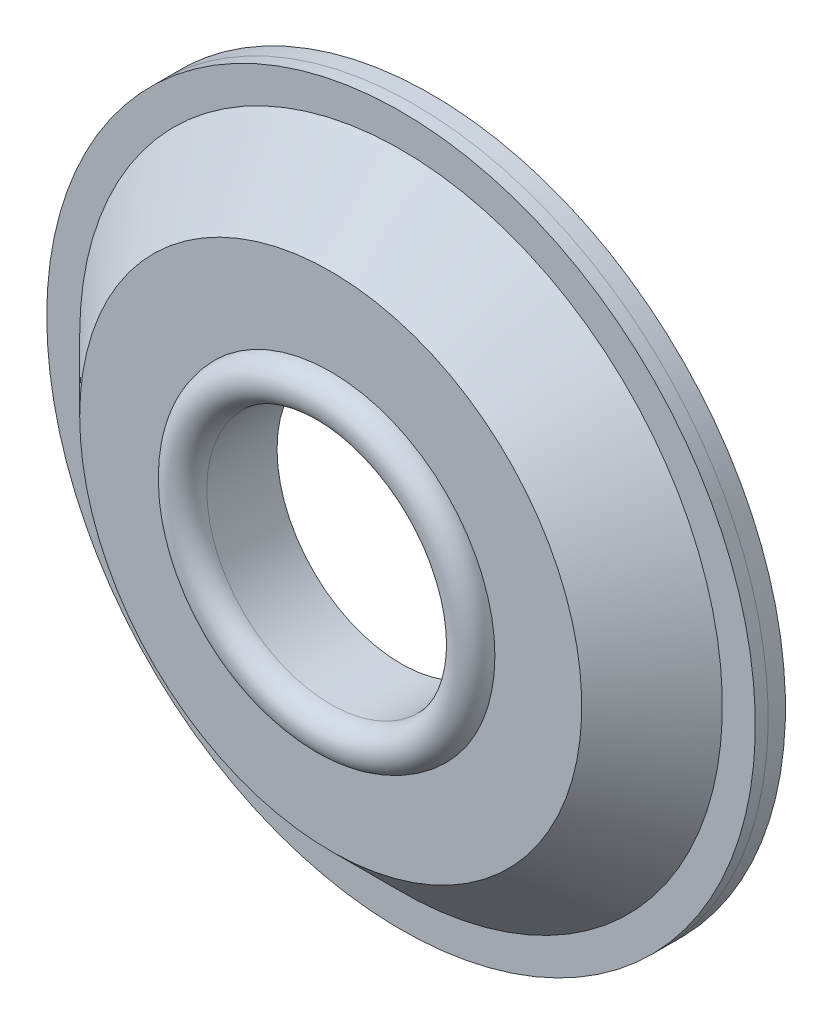
ISO-10303-21;
HEADER;
FILE_DESCRIPTION(('STEP AP214'),'2;1');
FILE_NAME('part.step','',(''),(''),'','','');
FILE_SCHEMA(('AUTOMOTIVE_DESIGN { 1 0 10303 214 1 1 1 1 }'));
ENDSEC;
DATA;
#1=APPLICATION_CONTEXT('core data for automotive mechanical design processes');
#2=APPLICATION_PROTOCOL_DEFINITION('international standard','automotive_design',2000,#1);
#3=PRODUCT_CONTEXT('',#1,'mechanical');
#4=PRODUCT('Part','Part','',(#3));
#5=PRODUCT_RELATED_PRODUCT_CATEGORY('part','',(#4));
#6=PRODUCT_DEFINITION_FORMATION('','',#4);
#7=PRODUCT_DEFINITION_CONTEXT('part definition',#1,'design');
#8=PRODUCT_DEFINITION('design','',#6,#7);
#9=PRODUCT_DEFINITION_SHAPE('','',#8);
#10=(LENGTH_UNIT() NAMED_UNIT(*) SI_UNIT(.MILLI.,.METRE.));
#11=(NAMED_UNIT(*) PLANE_ANGLE_UNIT() SI_UNIT($,.RADIAN.));
#12=(NAMED_UNIT(*) SI_UNIT($,.STERADIAN.) SOLID_ANGLE_UNIT());
#13=UNCERTAINTY_MEASURE_WITH_UNIT(LENGTH_MEASURE(1.E-05),#10,'distance_accuracy_value','');
#14=(GEOMETRIC_REPRESENTATION_CONTEXT(3) GLOBAL_UNCERTAINTY_ASSIGNED_CONTEXT((#13)) GLOBAL_UNIT_ASSIGNED_CONTEXT((#10,
#11,#12)) REPRESENTATION_CONTEXT('',''));
#15=CARTESIAN_POINT('',(0.,0.,0.));
#16=DIRECTION('',(0.,0.,1.));
#17=DIRECTION('',(1.,0.,0.));
#18=AXIS2_PLACEMENT_3D('',#15,#16,#17);
#19=CARTESIAN_POINT('',(0.,0.,1.3890625));
#20=DIRECTION('',(0.,0.,-1.));
#21=DIRECTION('',(-1.,0.,0.));
#22=AXIS2_PLACEMENT_3D('',#19,#20,#21);
#23=TOROIDAL_SURFACE('',#22,2.846875,0.396875);
#24=CARTESIAN_POINT('',(0.,0.,1.3890625));
#25=DIRECTION('',(0.,0.,-1.));
#26=DIRECTION('',(-1.,0.,0.));
#27=AXIS2_PLACEMENT_3D('',#24,#25,#26);
#28=CIRCLE('',#27,3.24375);
#29=CARTESIAN_POINT('',(-3.24375,0.,1.3890625));
#30=VERTEX_POINT('',#29);
#31=EDGE_CURVE('E11',#30,#30,#28,.T.);
#32=ORIENTED_EDGE('',*,*,#31,.F.);
#33=EDGE_LOOP('',(#32));
#34=FACE_BOUND('',#33,.T.);
#35=CARTESIAN_POINT('',(0.,0.,1.3890625));
#36=DIRECTION('',(0.,0.,-1.));
#37=DIRECTION('',(-1.,0.,0.));
#38=AXIS2_PLACEMENT_3D('',#35,#36,#37);
#39=CIRCLE('',#38,2.45);
#40=CARTESIAN_POINT('',(-2.45,0.,1.3890625));
#41=VERTEX_POINT('',#40);
#42=EDGE_CURVE('E91',#41,#41,#39,.T.);
#43=ORIENTED_EDGE('',*,*,#42,.T.);
#44=EDGE_LOOP('',(#43));
#45=FACE_BOUND('',#44,.T.);
#46=ADVANCED_FACE('F42',(#34,#45),#23,.T.);
#47=CARTESIAN_POINT('',(3.24375,0.,1.3890625));
#48=DIRECTION('',(0.,0.,1.));
#49=DIRECTION('',(1.,0.,0.));
#50=AXIS2_PLACEMENT_3D('',#47,#48,#49);
#51=PLANE('',#50);
#52=CARTESIAN_POINT('',(0.,0.,1.3890625));
#53=DIRECTION('',(0.,0.,-1.));
#54=DIRECTION('',(-1.,0.,0.));
#55=AXIS2_PLACEMENT_3D('',#52,#53,#54);
#56=CIRCLE('',#55,2.70399999999999);
#57=CARTESIAN_POINT('',(-2.70399999999999,0.,1.3890625));
#58=VERTEX_POINT('',#57);
#59=EDGE_CURVE('E48',#58,#58,#56,.T.);
#60=ORIENTED_EDGE('',*,*,#59,.F.);
#61=EDGE_LOOP('',(#60));
#62=FACE_BOUND('',#61,.T.);
#63=ORIENTED_EDGE('',*,*,#31,.T.);
#64=EDGE_LOOP('',(#63));
#65=FACE_BOUND('',#64,.T.);
#66=ADVANCED_FACE('F170',(#62,#65),#51,.F.);
#67=CARTESIAN_POINT('',(0.,0.,-2.0850225));
#68=DIRECTION('',(0.,0.,-1.));
#69=DIRECTION('',(-1.,0.,0.));
#70=AXIS2_PLACEMENT_3D('',#67,#68,#69);
#71=CYLINDRICAL_SURFACE('',#70,2.70399999999999);
#72=CARTESIAN_POINT('',(0.,0.,1.1350625));
#73=DIRECTION('',(0.,0.,-1.));
#74=DIRECTION('',(-1.,0.,0.));
#75=AXIS2_PLACEMENT_3D('',#72,#73,#74);
#76=CIRCLE('',#75,2.70399999999999);
#77=CARTESIAN_POINT('',(-2.70399999999999,0.,1.1350625));
#78=VERTEX_POINT('',#77);
#79=EDGE_CURVE('E52',#78,#78,#76,.T.);
#80=ORIENTED_EDGE('',*,*,#79,.F.);
#81=EDGE_LOOP('',(#80));
#82=FACE_BOUND('',#81,.T.);
#83=ORIENTED_EDGE('',*,*,#59,.T.);
#84=EDGE_LOOP('',(#83));
#85=FACE_BOUND('',#84,.T.);
#86=ADVANCED_FACE('F165',(#82,#85),#71,.T.);
#87=CARTESIAN_POINT('',(2.70399999999999,0.,1.1350625));
#88=DIRECTION('',(0.,0.,-1.));
#89=DIRECTION('',(-1.,0.,0.));
#90=AXIS2_PLACEMENT_3D('',#87,#88,#89);
#91=PLANE('',#90);
#92=CARTESIAN_POINT('',(0.,0.,1.1350625));
#93=DIRECTION('',(0.,0.,-1.));
#94=DIRECTION('',(-1.,0.,0.));
#95=AXIS2_PLACEMENT_3D('',#92,#93,#94);
#96=CIRCLE('',#95,4.85485225515724);
#97=CARTESIAN_POINT('',(-4.85485225515724,0.,1.1350625));
#98=VERTEX_POINT('',#97);
#99=EDGE_CURVE('E56',#98,#98,#96,.T.);
#100=ORIENTED_EDGE('',*,*,#99,.F.);
#101=EDGE_LOOP('',(#100));
#102=FACE_BOUND('',#101,.T.);
#103=ORIENTED_EDGE('',*,*,#79,.T.);
#104=EDGE_LOOP('',(#103));
#105=FACE_BOUND('',#104,.T.);
#106=ADVANCED_FACE('F159',(#102,#105),#91,.F.);
#107=CARTESIAN_POINT('',(0.,0.,1.1350625));
#108=DIRECTION('',(0.,0.,-1.));
#109=DIRECTION('',(-1.,0.,0.));
#110=AXIS2_PLACEMENT_3D('',#107,#108,#109);
#111=CONICAL_SURFACE('',#110,4.85485225515724,0.785398163397446);
#112=CARTESIAN_POINT('',(0.,0.,-0.253999999999999));
#113=DIRECTION('',(0.,0.,-1.));
#114=DIRECTION('',(-1.,0.,0.));
#115=AXIS2_PLACEMENT_3D('',#112,#113,#114);
#116=CIRCLE('',#115,6.24391475515723);
#117=CARTESIAN_POINT('',(-6.24391475515723,0.,-0.253999999999999));
#118=VERTEX_POINT('',#117);
#119=EDGE_CURVE('E61',#118,#118,#116,.T.);
#120=ORIENTED_EDGE('',*,*,#119,.F.);
#121=EDGE_LOOP('',(#120));
#122=FACE_BOUND('',#121,.T.);
#123=ORIENTED_EDGE('',*,*,#99,.T.);
#124=EDGE_LOOP('',(#123));
#125=FACE_BOUND('',#124,.T.);
#126=ADVANCED_FACE('F153',(#122,#125),#111,.T.);
#127=CARTESIAN_POINT('',(6.24391475515723,0.,-0.253999999999999));
#128=DIRECTION('',(0.,0.,-1.));
#129=DIRECTION('',(-1.,0.,0.));
#130=AXIS2_PLACEMENT_3D('',#127,#128,#129);
#131=PLANE('',#130);
#132=CARTESIAN_POINT('',(0.,0.,-0.253999999999999));
#133=DIRECTION('',(0.,0.,-1.));
#134=DIRECTION('',(-1.,0.,0.));
#135=AXIS2_PLACEMENT_3D('',#132,#133,#134);
#136=CIRCLE('',#135,7.);
#137=CARTESIAN_POINT('',(-7.,0.,-0.253999999999999));
#138=VERTEX_POINT('',#137);
#139=EDGE_CURVE('E64',#138,#138,#136,.T.);
#140=ORIENTED_EDGE('',*,*,#139,.F.);
#141=EDGE_LOOP('',(#140));
#142=FACE_BOUND('',#141,.T.);
#143=ORIENTED_EDGE('',*,*,#119,.T.);
#144=EDGE_LOOP('',(#143));
#145=FACE_BOUND('',#144,.T.);
#146=ADVANCED_FACE('F147',(#142,#145),#131,.F.);
#147=CARTESIAN_POINT('',(0.,0.,-2.0850225));
#148=DIRECTION('',(0.,0.,-1.));
#149=DIRECTION('',(-1.,0.,0.));
#150=AXIS2_PLACEMENT_3D('',#147,#148,#149);
#151=CYLINDRICAL_SURFACE('',#150,7.);
#152=CARTESIAN_POINT('',(0.,0.,-0.5953125));
#153=DIRECTION('',(0.,0.,-1.));
#154=DIRECTION('',(-1.,0.,0.));
#155=AXIS2_PLACEMENT_3D('',#152,#153,#154);
#156=CIRCLE('',#155,7.);
#157=CARTESIAN_POINT('',(-7.,0.,-0.5953125));
#158=VERTEX_POINT('',#157);
#159=EDGE_CURVE('E67',#158,#158,#156,.T.);
#160=ORIENTED_EDGE('',*,*,#159,.F.);
#161=EDGE_LOOP('',(#160));
#162=FACE_BOUND('',#161,.T.);
#163=ORIENTED_EDGE('',*,*,#139,.T.);
#164=EDGE_LOOP('',(#163));
#165=FACE_BOUND('',#164,.T.);
#166=ADVANCED_FACE('F141',(#162,#165),#151,.T.);
#167=CARTESIAN_POINT('',(5.809375,0.,-0.595312500000001));
#168=DIRECTION('',(0.,0.,1.));
#169=DIRECTION('',(1.,0.,0.));
#170=AXIS2_PLACEMENT_3D('',#167,#168,#169);
#171=PLANE('',#170);
#172=CARTESIAN_POINT('',(0.,0.,-0.595312500000001));
#173=DIRECTION('',(0.,0.,-1.));
#174=DIRECTION('',(-1.,0.,0.));
#175=AXIS2_PLACEMENT_3D('',#172,#173,#174);
#176=CIRCLE('',#175,5.809375);
#177=CARTESIAN_POINT('',(-5.809375,0.,-0.595312500000001));
#178=VERTEX_POINT('',#177);
#179=EDGE_CURVE('E70',#178,#178,#176,.T.);
#180=ORIENTED_EDGE('',*,*,#179,.F.);
#181=EDGE_LOOP('',(#180));
#182=FACE_BOUND('',#181,.T.);
#183=ORIENTED_EDGE('',*,*,#159,.T.);
#184=EDGE_LOOP('',(#183));
#185=FACE_BOUND('',#184,.T.);
#186=ADVANCED_FACE('F135',(#182,#185),#171,.F.);
#187=CARTESIAN_POINT('',(0.,0.,-0.595312500000001));
#188=DIRECTION('',(0.,0.,-1.));
#189=DIRECTION('',(-1.,0.,0.));
#190=AXIS2_PLACEMENT_3D('',#187,#188,#189);
#191=CONICAL_SURFACE('',#190,5.809375,0.785398163397445);
#192=CARTESIAN_POINT('',(0.,0.,0.254));
#193=DIRECTION('',(0.,0.,-1.));
#194=DIRECTION('',(-1.,0.,0.));
#195=AXIS2_PLACEMENT_3D('',#192,#193,#194);
#196=CIRCLE('',#195,4.9600625);
#197=CARTESIAN_POINT('',(-4.9600625,0.,0.254));
#198=VERTEX_POINT('',#197);
#199=EDGE_CURVE('E73',#198,#198,#196,.T.);
#200=ORIENTED_EDGE('',*,*,#199,.F.);
#201=EDGE_LOOP('',(#200));
#202=FACE_BOUND('',#201,.T.);
#203=ORIENTED_EDGE('',*,*,#179,.T.);
#204=EDGE_LOOP('',(#203));
#205=FACE_BOUND('',#204,.T.);
#206=ADVANCED_FACE('F129',(#202,#205),#191,.F.);
#207=CARTESIAN_POINT('',(0.,0.,0.254));
#208=DIRECTION('',(0.,0.,1.));
#209=DIRECTION('',(1.,0.,0.));
#210=AXIS2_PLACEMENT_3D('',#207,#208,#209);
#211=CONICAL_SURFACE('',#210,4.9600625,0.436332312998582);
#212=CARTESIAN_POINT('',(0.,0.,-0.982662500000005));
#213=DIRECTION('',(0.,0.,-1.));
#214=DIRECTION('',(-1.,0.,0.));
#215=AXIS2_PLACEMENT_3D('',#212,#213,#214);
#216=CIRCLE('',#215,4.3833973056969);
#217=CARTESIAN_POINT('',(-4.3833973056969,0.,-0.982662500000005));
#218=VERTEX_POINT('',#217);
#219=EDGE_CURVE('E76',#218,#218,#216,.T.);
#220=ORIENTED_EDGE('',*,*,#219,.F.);
#221=EDGE_LOOP('',(#220));
#222=FACE_BOUND('',#221,.T.);
#223=ORIENTED_EDGE('',*,*,#199,.T.);
#224=EDGE_LOOP('',(#223));
#225=FACE_BOUND('',#224,.T.);
#226=ADVANCED_FACE('F123',(#222,#225),#211,.T.);
#227=CARTESIAN_POINT('',(0.,0.,-0.982662500000005));
#228=DIRECTION('',(0.,0.,-1.));
#229=DIRECTION('',(-1.,0.,0.));
#230=AXIS2_PLACEMENT_3D('',#227,#228,#229);
#231=CONICAL_SURFACE('',#230,4.3833973056969,0.436332312998576);
#232=CARTESIAN_POINT('',(0.,0.,0.635));
#233=DIRECTION('',(0.,0.,-1.));
#234=DIRECTION('',(-1.,0.,0.));
#235=AXIS2_PLACEMENT_3D('',#232,#233,#234);
#236=CIRCLE('',#235,3.62906889363675);
#237=CARTESIAN_POINT('',(-3.62906889363675,0.,0.635));
#238=VERTEX_POINT('',#237);
#239=EDGE_CURVE('E79',#238,#238,#236,.T.);
#240=ORIENTED_EDGE('',*,*,#239,.F.);
#241=EDGE_LOOP('',(#240));
#242=FACE_BOUND('',#241,.T.);
#243=ORIENTED_EDGE('',*,*,#219,.T.);
#244=EDGE_LOOP('',(#243));
#245=FACE_BOUND('',#244,.T.);
#246=ADVANCED_FACE('F117',(#242,#245),#231,.F.);
#247=CARTESIAN_POINT('',(3.56125,0.,0.635));
#248=DIRECTION('',(0.,0.,1.));
#249=DIRECTION('',(1.,0.,0.));
#250=AXIS2_PLACEMENT_3D('',#247,#248,#249);
#251=PLANE('',#250);
#252=CARTESIAN_POINT('',(0.,0.,0.635));
#253=DIRECTION('',(0.,0.,-1.));
#254=DIRECTION('',(-1.,0.,0.));
#255=AXIS2_PLACEMENT_3D('',#252,#253,#254);
#256=CIRCLE('',#255,3.56125);
#257=CARTESIAN_POINT('',(-3.56125,0.,0.635));
#258=VERTEX_POINT('',#257);
#259=EDGE_CURVE('E82',#258,#258,#256,.T.);
#260=ORIENTED_EDGE('',*,*,#259,.F.);
#261=EDGE_LOOP('',(#260));
#262=FACE_BOUND('',#261,.T.);
#263=ORIENTED_EDGE('',*,*,#239,.T.);
#264=EDGE_LOOP('',(#263));
#265=FACE_BOUND('',#264,.T.);
#266=ADVANCED_FACE('F111',(#262,#265),#251,.F.);
#267=CARTESIAN_POINT('',(0.,0.,-2.0850225));
#268=DIRECTION('',(0.,0.,-1.));
#269=DIRECTION('',(-1.,0.,0.));
#270=AXIS2_PLACEMENT_3D('',#267,#268,#269);
#271=CYLINDRICAL_SURFACE('',#270,3.56125);
#272=CARTESIAN_POINT('',(0.,0.,0.));
#273=DIRECTION('',(0.,0.,-1.));
#274=DIRECTION('',(-1.,0.,0.));
#275=AXIS2_PLACEMENT_3D('',#272,#273,#274);
#276=CIRCLE('',#275,3.56125);
#277=CARTESIAN_POINT('',(-3.56125,0.,0.));
#278=VERTEX_POINT('',#277);
#279=EDGE_CURVE('E85',#278,#278,#276,.T.);
#280=ORIENTED_EDGE('',*,*,#279,.F.);
#281=EDGE_LOOP('',(#280));
#282=FACE_BOUND('',#281,.T.);
#283=ORIENTED_EDGE('',*,*,#259,.T.);
#284=EDGE_LOOP('',(#283));
#285=FACE_BOUND('',#284,.T.);
#286=ADVANCED_FACE('F105',(#282,#285),#271,.T.);
#287=CARTESIAN_POINT('',(2.45,0.,0.));
#288=DIRECTION('',(0.,0.,1.));
#289=DIRECTION('',(1.,0.,0.));
#290=AXIS2_PLACEMENT_3D('',#287,#288,#289);
#291=PLANE('',#290);
#292=CARTESIAN_POINT('',(0.,0.,0.));
#293=DIRECTION('',(0.,0.,-1.));
#294=DIRECTION('',(-1.,0.,0.));
#295=AXIS2_PLACEMENT_3D('',#292,#293,#294);
#296=CIRCLE('',#295,2.45);
#297=CARTESIAN_POINT('',(-2.45,0.,0.));
#298=VERTEX_POINT('',#297);
#299=EDGE_CURVE('E88',#298,#298,#296,.T.);
#300=ORIENTED_EDGE('',*,*,#299,.F.);
#301=EDGE_LOOP('',(#300));
#302=FACE_BOUND('',#301,.T.);
#303=ORIENTED_EDGE('',*,*,#279,.T.);
#304=EDGE_LOOP('',(#303));
#305=FACE_BOUND('',#304,.T.);
#306=ADVANCED_FACE('F99',(#302,#305),#291,.F.);
#307=CARTESIAN_POINT('',(0.,0.,-2.0850225));
#308=DIRECTION('',(0.,0.,-1.));
#309=DIRECTION('',(-1.,0.,0.));
#310=AXIS2_PLACEMENT_3D('',#307,#308,#309);
#311=CYLINDRICAL_SURFACE('',#310,2.45);
#312=ORIENTED_EDGE('',*,*,#42,.F.);
#313=EDGE_LOOP('',(#312));
#314=FACE_BOUND('',#313,.T.);
#315=ORIENTED_EDGE('',*,*,#299,.T.);
#316=EDGE_LOOP('',(#315));
#317=FACE_BOUND('',#316,.T.);
#318=ADVANCED_FACE('F96',(#314,#317),#311,.F.);
#319=CLOSED_SHELL('',(#46,#66,#86,#106,#126,#146,#166,#186,#206,#226,#246,#266,#286,#306,#318));
#320=MANIFOLD_SOLID_BREP('B2',#319);
#321=CARTESIAN_POINT('',(3.24375,0.,1.3890625));
#322=DIRECTION('',(0.,0.,-1.));
#323=DIRECTION('',(-1.,0.,0.));
#324=AXIS2_PLACEMENT_3D('',#321,#322,#323);
#325=PLANE('',#324);
#326=CARTESIAN_POINT('',(0.,0.,1.3890625));
#327=DIRECTION('',(0.,0.,-1.));
#328=DIRECTION('',(-1.,0.,0.));
#329=AXIS2_PLACEMENT_3D('',#326,#327,#328);
#330=CIRCLE('',#329,4.9600625);
#331=CARTESIAN_POINT('',(-4.9600625,0.,1.3890625));
#332=VERTEX_POINT('',#331);
#333=EDGE_CURVE('E296',#332,#332,#330,.T.);
#334=ORIENTED_EDGE('',*,*,#333,.F.);
#335=EDGE_LOOP('',(#334));
#336=FACE_BOUND('',#335,.T.);
#337=CARTESIAN_POINT('',(0.,0.,1.3890625));
#338=DIRECTION('',(0.,0.,-1.));
#339=DIRECTION('',(-1.,0.,0.));
#340=AXIS2_PLACEMENT_3D('',#337,#338,#339);
#341=CIRCLE('',#340,2.70399999999999);
#342=CARTESIAN_POINT('',(-2.70399999999999,0.,1.3890625));
#343=VERTEX_POINT('',#342);
#344=EDGE_CURVE('E41',#343,#343,#341,.T.);
#345=ORIENTED_EDGE('',*,*,#344,.T.);
#346=EDGE_LOOP('',(#345));
#347=FACE_BOUND('',#346,.T.);
#348=ADVANCED_FACE('F268',(#336,#347),#325,.F.);
#349=CARTESIAN_POINT('',(0.,0.,-2.0850225));
#350=DIRECTION('',(0.,0.,-1.));
#351=DIRECTION('',(-1.,0.,0.));
#352=AXIS2_PLACEMENT_3D('',#349,#350,#351);
#353=CYLINDRICAL_SURFACE('',#352,2.70399999999999);
#354=ORIENTED_EDGE('',*,*,#344,.F.);
#355=EDGE_LOOP('',(#354));
#356=FACE_BOUND('',#355,.T.);
#357=CARTESIAN_POINT('',(0.,0.,1.1350625));
#358=DIRECTION('',(0.,0.,-1.));
#359=DIRECTION('',(-1.,0.,0.));
#360=AXIS2_PLACEMENT_3D('',#357,#358,#359);
#361=CIRCLE('',#360,2.70399999999999);
#362=CARTESIAN_POINT('',(-2.70399999999999,0.,1.1350625));
#363=VERTEX_POINT('',#362);
#364=EDGE_CURVE('E274',#363,#363,#361,.T.);
#365=ORIENTED_EDGE('',*,*,#364,.T.);
#366=EDGE_LOOP('',(#365));
#367=FACE_BOUND('',#366,.T.);
#368=ADVANCED_FACE('F303',(#356,#367),#353,.F.);
#369=CARTESIAN_POINT('',(2.70399999999999,0.,1.1350625));
#370=DIRECTION('',(0.,0.,1.));
#371=DIRECTION('',(1.,0.,0.));
#372=AXIS2_PLACEMENT_3D('',#369,#370,#371);
#373=PLANE('',#372);
#374=ORIENTED_EDGE('',*,*,#364,.F.);
#375=EDGE_LOOP('',(#374));
#376=FACE_BOUND('',#375,.T.);
#377=CARTESIAN_POINT('',(0.,0.,1.1350625));
#378=DIRECTION('',(0.,0.,-1.));
#379=DIRECTION('',(-1.,0.,0.));
#380=AXIS2_PLACEMENT_3D('',#377,#378,#379);
#381=CIRCLE('',#380,4.85485225515724);
#382=CARTESIAN_POINT('',(-4.85485225515724,0.,1.1350625));
#383=VERTEX_POINT('',#382);
#384=EDGE_CURVE('E278',#383,#383,#381,.T.);
#385=ORIENTED_EDGE('',*,*,#384,.T.);
#386=EDGE_LOOP('',(#385));
#387=FACE_BOUND('',#386,.T.);
#388=ADVANCED_FACE('F307',(#376,#387),#373,.F.);
#389=CARTESIAN_POINT('',(0.,0.,-0.253999999999999));
#390=DIRECTION('',(0.,0.,-1.));
#391=DIRECTION('',(-1.,0.,0.));
#392=AXIS2_PLACEMENT_3D('',#389,#390,#391);
#393=CONICAL_SURFACE('',#392,6.24391475515723,0.785398163397446);
#394=ORIENTED_EDGE('',*,*,#384,.F.);
#395=EDGE_LOOP('',(#394));
#396=FACE_BOUND('',#395,.T.);
#397=CARTESIAN_POINT('',(0.,0.,-0.253999999999999));
#398=DIRECTION('',(0.,0.,-1.));
#399=DIRECTION('',(-1.,0.,0.));
#400=AXIS2_PLACEMENT_3D('',#397,#398,#399);
#401=CIRCLE('',#400,6.24391475515723);
#402=CARTESIAN_POINT('',(-6.24391475515723,0.,-0.253999999999999));
#403=VERTEX_POINT('',#402);
#404=EDGE_CURVE('E282',#403,#403,#401,.T.);
#405=ORIENTED_EDGE('',*,*,#404,.T.);
#406=EDGE_LOOP('',(#405));
#407=FACE_BOUND('',#406,.T.);
#408=ADVANCED_FACE('F312',(#396,#407),#393,.F.);
#409=CARTESIAN_POINT('',(6.24391475515723,0.,-0.253999999999999));
#410=DIRECTION('',(0.,0.,1.));
#411=DIRECTION('',(1.,0.,0.));
#412=AXIS2_PLACEMENT_3D('',#409,#410,#411);
#413=PLANE('',#412);
#414=ORIENTED_EDGE('',*,*,#404,.F.);
#415=EDGE_LOOP('',(#414));
#416=FACE_BOUND('',#415,.T.);
#417=CARTESIAN_POINT('',(0.,0.,-0.253999999999999));
#418=DIRECTION('',(0.,0.,-1.));
#419=DIRECTION('',(-1.,0.,0.));
#420=AXIS2_PLACEMENT_3D('',#417,#418,#419);
#421=CIRCLE('',#420,7.);
#422=CARTESIAN_POINT('',(-7.,0.,-0.253999999999999));
#423=VERTEX_POINT('',#422);
#424=EDGE_CURVE('E287',#423,#423,#421,.T.);
#425=ORIENTED_EDGE('',*,*,#424,.T.);
#426=EDGE_LOOP('',(#425));
#427=FACE_BOUND('',#426,.T.);
#428=ADVANCED_FACE('F318',(#416,#427),#413,.F.);
#429=CARTESIAN_POINT('',(0.,0.,-2.0850225));
#430=DIRECTION('',(0.,0.,-1.));
#431=DIRECTION('',(-1.,0.,0.));
#432=AXIS2_PLACEMENT_3D('',#429,#430,#431);
#433=CYLINDRICAL_SURFACE('',#432,7.);
#434=ORIENTED_EDGE('',*,*,#424,.F.);
#435=EDGE_LOOP('',(#434));
#436=FACE_BOUND('',#435,.T.);
#437=CARTESIAN_POINT('',(0.,0.,0.));
#438=DIRECTION('',(0.,0.,-1.));
#439=DIRECTION('',(-1.,0.,0.));
#440=AXIS2_PLACEMENT_3D('',#437,#438,#439);
#441=CIRCLE('',#440,7.);
#442=CARTESIAN_POINT('',(-7.,0.,0.));
#443=VERTEX_POINT('',#442);
#444=EDGE_CURVE('E290',#443,#443,#441,.T.);
#445=ORIENTED_EDGE('',*,*,#444,.T.);
#446=EDGE_LOOP('',(#445));
#447=FACE_BOUND('',#446,.T.);
#448=ADVANCED_FACE('F322',(#436,#447),#433,.T.);
#449=CARTESIAN_POINT('',(7.,0.,0.));
#450=DIRECTION('',(0.,0.,-1.));
#451=DIRECTION('',(-1.,0.,0.));
#452=AXIS2_PLACEMENT_3D('',#449,#450,#451);
#453=PLANE('',#452);
#454=ORIENTED_EDGE('',*,*,#444,.F.);
#455=EDGE_LOOP('',(#454));
#456=FACE_BOUND('',#455,.T.);
#457=CARTESIAN_POINT('',(0.,0.,0.));
#458=DIRECTION('',(0.,0.,-1.));
#459=DIRECTION('',(-1.,0.,0.));
#460=AXIS2_PLACEMENT_3D('',#457,#458,#459);
#461=CIRCLE('',#460,6.349125);
#462=CARTESIAN_POINT('',(-6.349125,0.,0.));
#463=VERTEX_POINT('',#462);
#464=EDGE_CURVE('E293',#463,#463,#461,.T.);
#465=ORIENTED_EDGE('',*,*,#464,.T.);
#466=EDGE_LOOP('',(#465));
#467=FACE_BOUND('',#466,.T.);
#468=ADVANCED_FACE('F326',(#456,#467),#453,.F.);
#469=CARTESIAN_POINT('',(0.,0.,1.3890625));
#470=DIRECTION('',(0.,0.,-1.));
#471=DIRECTION('',(-1.,0.,0.));
#472=AXIS2_PLACEMENT_3D('',#469,#470,#471);
#473=CONICAL_SURFACE('',#472,4.9600625,0.785398163397445);
#474=ORIENTED_EDGE('',*,*,#464,.F.);
#475=EDGE_LOOP('',(#474));
#476=FACE_BOUND('',#475,.T.);
#477=ORIENTED_EDGE('',*,*,#333,.T.);
#478=EDGE_LOOP('',(#477));
#479=FACE_BOUND('',#478,.T.);
#480=ADVANCED_FACE('F300',(#476,#479),#473,.T.);
#481=CLOSED_SHELL('',(#348,#368,#388,#408,#428,#448,#468,#480));
#482=MANIFOLD_SOLID_BREP('B6',#481);
#483=ADVANCED_BREP_SHAPE_REPRESENTATION('',(#18,#320,#482),#14);
#484=SHAPE_DEFINITION_REPRESENTATION(#9,#483);
ENDSEC;
END-ISO-10303-21;
